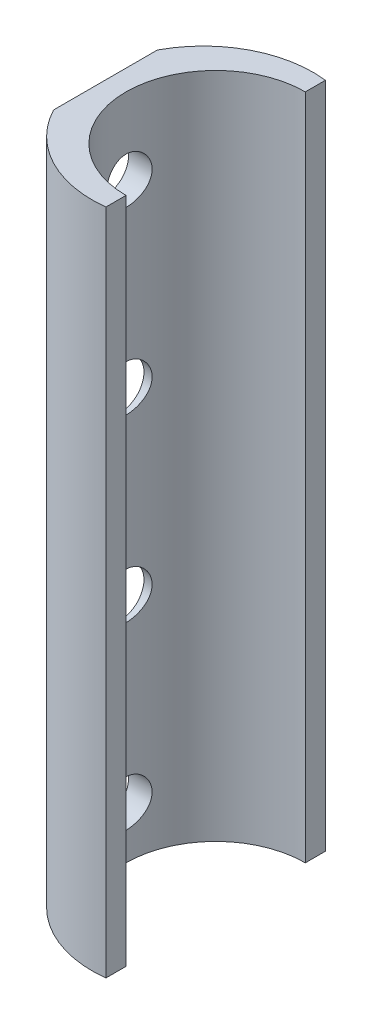
ISO-10303-21;
HEADER;
FILE_DESCRIPTION(('STEP AP214'),'2;1');
FILE_NAME('part.step','',(''),(''),'','','');
FILE_SCHEMA(('AUTOMOTIVE_DESIGN { 1 0 10303 214 1 1 1 1 }'));
ENDSEC;
DATA;
#1=APPLICATION_CONTEXT('core data for automotive mechanical design processes');
#2=APPLICATION_PROTOCOL_DEFINITION('international standard','automotive_design',2000,#1);
#3=PRODUCT_CONTEXT('',#1,'mechanical');
#4=PRODUCT('Part','Part','',(#3));
#5=PRODUCT_RELATED_PRODUCT_CATEGORY('part','',(#4));
#6=PRODUCT_DEFINITION_FORMATION('','',#4);
#7=PRODUCT_DEFINITION_CONTEXT('part definition',#1,'design');
#8=PRODUCT_DEFINITION('design','',#6,#7);
#9=PRODUCT_DEFINITION_SHAPE('','',#8);
#10=(LENGTH_UNIT() NAMED_UNIT(*) SI_UNIT(.MILLI.,.METRE.));
#11=(NAMED_UNIT(*) PLANE_ANGLE_UNIT() SI_UNIT($,.RADIAN.));
#12=(NAMED_UNIT(*) SI_UNIT($,.STERADIAN.) SOLID_ANGLE_UNIT());
#13=UNCERTAINTY_MEASURE_WITH_UNIT(LENGTH_MEASURE(1.E-05),#10,'distance_accuracy_value','');
#14=(GEOMETRIC_REPRESENTATION_CONTEXT(3) GLOBAL_UNCERTAINTY_ASSIGNED_CONTEXT((#13)) GLOBAL_UNIT_ASSIGNED_CONTEXT((#10,
#11,#12)) REPRESENTATION_CONTEXT('',''));
#15=CARTESIAN_POINT('',(0.,0.,0.));
#16=DIRECTION('',(0.,0.,1.));
#17=DIRECTION('',(1.,0.,0.));
#18=AXIS2_PLACEMENT_3D('',#15,#16,#17);
#19=CARTESIAN_POINT('',(-76.5804417880104,84.1602094264812,20.2));
#20=DIRECTION('',(0.,-1.,0.));
#21=DIRECTION('',(0.,0.,-1.));
#22=AXIS2_PLACEMENT_3D('',#19,#20,#21);
#23=PLANE('',#22);
#24=DIRECTION('',(0.,0.,1.));
#25=VECTOR('',#24,1.);
#26=CARTESIAN_POINT('',(-55.1204417880104,84.1602094264812,0.));
#27=LINE('',#26,#25);
#28=CARTESIAN_POINT('',(-55.1204417880104,84.1602094264812,27.56));
#29=VERTEX_POINT('',#28);
#30=CARTESIAN_POINT('',(-55.1204417880104,84.1602094264812,31.47));
#31=VERTEX_POINT('',#30);
#32=EDGE_CURVE('E172',#29,#31,#27,.T.);
#33=ORIENTED_EDGE('',*,*,#32,.F.);
#34=CARTESIAN_POINT('',(-55.1204417880104,84.1602094264812,10.1));
#35=DIRECTION('',(0.,1.,0.));
#36=DIRECTION('',(0.,0.,1.));
#37=AXIS2_PLACEMENT_3D('',#34,#35,#36);
#38=CIRCLE('',#37,17.46);
#39=CARTESIAN_POINT('',(-55.1204417880104,84.1602094264812,-7.36000000000001));
#40=VERTEX_POINT('',#39);
#41=EDGE_CURVE('E191',#40,#29,#38,.T.);
#42=ORIENTED_EDGE('',*,*,#41,.F.);
#43=DIRECTION('',(0.,0.,1.));
#44=VECTOR('',#43,1.);
#45=CARTESIAN_POINT('',(-55.1204417880104,84.1602094264812,0.));
#46=LINE('',#45,#44);
#47=CARTESIAN_POINT('',(-55.1204417880104,84.1602094264812,-11.27));
#48=VERTEX_POINT('',#47);
#49=EDGE_CURVE('E185',#48,#40,#46,.T.);
#50=ORIENTED_EDGE('',*,*,#49,.F.);
#51=CARTESIAN_POINT('',(-57.6669665242023,84.1602094264812,9.94773107021489));
#52=DIRECTION('',(0.,1.,0.));
#53=DIRECTION('',(0.,0.,1.));
#54=AXIS2_PLACEMENT_3D('',#51,#52,#53);
#55=CIRCLE('',#54,21.37);
#56=CARTESIAN_POINT('',(-76.5804417880104,84.1602094264812,0.));
#57=VERTEX_POINT('',#56);
#58=EDGE_CURVE('E78',#57,#48,#55,.F.);
#59=ORIENTED_EDGE('',*,*,#58,.F.);
#60=DIRECTION('',(0.,0.,-1.));
#61=VECTOR('',#60,1.);
#62=CARTESIAN_POINT('',(-76.5804417880104,84.1602094264812,20.2));
#63=LINE('',#62,#61);
#64=CARTESIAN_POINT('',(-76.5804417880104,84.1602094264812,20.2));
#65=VERTEX_POINT('',#64);
#66=EDGE_CURVE('E214',#65,#57,#63,.T.);
#67=ORIENTED_EDGE('',*,*,#66,.F.);
#68=CARTESIAN_POINT('',(-57.6669665242023,84.1602094264812,10.2522689297851));
#69=DIRECTION('',(0.,1.,0.));
#70=DIRECTION('',(0.,0.,1.));
#71=AXIS2_PLACEMENT_3D('',#68,#69,#70);
#72=CIRCLE('',#71,21.37);
#73=EDGE_CURVE('E175',#65,#31,#72,.T.);
#74=ORIENTED_EDGE('',*,*,#73,.T.);
#75=EDGE_LOOP('',(#33,#42,#50,#59,#67,#74));
#76=FACE_BOUND('',#75,.T.);
#77=ADVANCED_FACE('F43',(#76),#23,.F.);
#78=CARTESIAN_POINT('',(-76.5804417880104,84.1602094264812,20.2));
#79=DIRECTION('',(1.,0.,0.));
#80=DIRECTION('',(0.,1.,0.));
#81=AXIS2_PLACEMENT_3D('',#78,#79,#80);
#82=PLANE('',#81);
#83=CARTESIAN_POINT('',(-76.5804417880104,69.1602094264812,10.1));
#84=DIRECTION('',(-1.,0.,0.));
#85=DIRECTION('',(0.,-1.,0.));
#86=AXIS2_PLACEMENT_3D('',#83,#84,#85);
#87=CIRCLE('',#86,4.5);
#88=CARTESIAN_POINT('',(-76.5804417880104,64.6602094264812,10.1));
#89=VERTEX_POINT('',#88);
#90=EDGE_CURVE('E150',#89,#89,#87,.T.);
#91=ORIENTED_EDGE('',*,*,#90,.F.);
#92=EDGE_LOOP('',(#91));
#93=FACE_BOUND('',#92,.T.);
#94=DIRECTION('',(0.,-1.,0.));
#95=VECTOR('',#94,1.);
#96=CARTESIAN_POINT('',(-76.5804417880104,84.1602094264812,0.));
#97=LINE('',#96,#95);
#98=CARTESIAN_POINT('',(-76.5804417880104,48.2602094264812,0.));
#99=VERTEX_POINT('',#98);
#100=EDGE_CURVE('E197',#57,#99,#97,.T.);
#101=ORIENTED_EDGE('',*,*,#100,.T.);
#102=DIRECTION('',(0.,0.,-1.));
#103=VECTOR('',#102,1.);
#104=CARTESIAN_POINT('',(-76.5804417880104,48.2602094264812,20.2));
#105=LINE('',#104,#103);
#106=CARTESIAN_POINT('',(-76.5804417880104,48.2602094264812,20.2));
#107=VERTEX_POINT('',#106);
#108=EDGE_CURVE('E135',#107,#99,#105,.T.);
#109=ORIENTED_EDGE('',*,*,#108,.F.);
#110=DIRECTION('',(0.,-1.,0.));
#111=VECTOR('',#110,1.);
#112=CARTESIAN_POINT('',(-76.5804417880104,84.1602094264812,20.2));
#113=LINE('',#112,#111);
#114=EDGE_CURVE('E200',#65,#107,#113,.T.);
#115=ORIENTED_EDGE('',*,*,#114,.F.);
#116=ORIENTED_EDGE('',*,*,#66,.T.);
#117=EDGE_LOOP('',(#101,#109,#115,#116));
#118=FACE_BOUND('',#117,.T.);
#119=ADVANCED_FACE('F258',(#93,#118),#82,.F.);
#120=CARTESIAN_POINT('',(-76.5804417880104,48.2602094264812,20.2));
#121=DIRECTION('',(0.,1.,0.));
#122=DIRECTION('',(0.,0.,1.));
#123=AXIS2_PLACEMENT_3D('',#120,#121,#122);
#124=PLANE('',#123);
#125=ORIENTED_EDGE('',*,*,#108,.T.);
#126=CARTESIAN_POINT('',(-57.6669665242023,48.2602094264812,9.94773107021489));
#127=DIRECTION('',(0.,1.,0.));
#128=DIRECTION('',(0.,0.,1.));
#129=AXIS2_PLACEMENT_3D('',#126,#127,#128);
#130=CIRCLE('',#129,21.37);
#131=CARTESIAN_POINT('',(-73.5804417880104,48.2602094264812,-4.3154454703797));
#132=VERTEX_POINT('',#131);
#133=EDGE_CURVE('E84',#132,#99,#130,.T.);
#134=ORIENTED_EDGE('',*,*,#133,.F.);
#135=DIRECTION('',(0.,0.,-1.));
#136=VECTOR('',#135,1.);
#137=CARTESIAN_POINT('',(-73.5804417880104,48.2602094264812,20.2));
#138=LINE('',#137,#136);
#139=CARTESIAN_POINT('',(-73.5804417880104,48.2602094264812,24.5154454703797));
#140=VERTEX_POINT('',#139);
#141=EDGE_CURVE('E57',#140,#132,#138,.T.);
#142=ORIENTED_EDGE('',*,*,#141,.F.);
#143=CARTESIAN_POINT('',(-57.6669665242023,48.2602094264812,10.2522689297851));
#144=DIRECTION('',(0.,1.,0.));
#145=DIRECTION('',(0.,0.,1.));
#146=AXIS2_PLACEMENT_3D('',#143,#144,#145);
#147=CIRCLE('',#146,21.37);
#148=EDGE_CURVE('E50',#140,#107,#147,.F.);
#149=ORIENTED_EDGE('',*,*,#148,.T.);
#150=EDGE_LOOP('',(#125,#134,#142,#149));
#151=FACE_BOUND('',#150,.T.);
#152=ADVANCED_FACE('F139',(#151),#124,.F.);
#153=CARTESIAN_POINT('',(-73.5804417880104,48.2602094264812,20.2));
#154=DIRECTION('',(1.,0.,0.));
#155=DIRECTION('',(0.,1.,0.));
#156=AXIS2_PLACEMENT_3D('',#153,#154,#155);
#157=PLANE('',#156);
#158=CARTESIAN_POINT('',(-73.5804417880104,34.1602094264812,10.1));
#159=DIRECTION('',(1.,0.,0.));
#160=DIRECTION('',(0.,1.,0.));
#161=AXIS2_PLACEMENT_3D('',#158,#159,#160);
#162=CIRCLE('',#161,4.5);
#163=CARTESIAN_POINT('',(-73.5804417880104,38.6602094264812,10.1));
#164=VERTEX_POINT('',#163);
#165=EDGE_CURVE('E161',#164,#164,#162,.T.);
#166=ORIENTED_EDGE('',*,*,#165,.T.);
#167=EDGE_LOOP('',(#166));
#168=FACE_BOUND('',#167,.T.);
#169=CARTESIAN_POINT('',(-73.5804417880104,-0.839790573518796,10.1));
#170=DIRECTION('',(1.,0.,0.));
#171=DIRECTION('',(0.,1.,0.));
#172=AXIS2_PLACEMENT_3D('',#169,#170,#171);
#173=CIRCLE('',#172,4.5);
#174=CARTESIAN_POINT('',(-73.5804417880104,3.6602094264812,10.1));
#175=VERTEX_POINT('',#174);
#176=EDGE_CURVE('E156',#175,#175,#173,.T.);
#177=ORIENTED_EDGE('',*,*,#176,.T.);
#178=EDGE_LOOP('',(#177));
#179=FACE_BOUND('',#178,.T.);
#180=ORIENTED_EDGE('',*,*,#141,.T.);
#181=DIRECTION('',(0.,1.,0.));
#182=VECTOR('',#181,1.);
#183=CARTESIAN_POINT('',(-73.5804417880104,-45.8397905735188,-4.3154454703797));
#184=LINE('',#183,#182);
#185=CARTESIAN_POINT('',(-73.5804417880104,-9.93979057351879,-4.3154454703797));
#186=VERTEX_POINT('',#185);
#187=EDGE_CURVE('E130',#186,#132,#184,.T.);
#188=ORIENTED_EDGE('',*,*,#187,.F.);
#189=DIRECTION('',(0.,0.,-1.));
#190=VECTOR('',#189,1.);
#191=CARTESIAN_POINT('',(-73.5804417880104,-9.93979057351879,20.2));
#192=LINE('',#191,#190);
#193=CARTESIAN_POINT('',(-73.5804417880104,-9.93979057351879,24.5154454703797));
#194=VERTEX_POINT('',#193);
#195=EDGE_CURVE('E136',#194,#186,#192,.T.);
#196=ORIENTED_EDGE('',*,*,#195,.F.);
#197=DIRECTION('',(0.,1.,0.));
#198=VECTOR('',#197,1.);
#199=CARTESIAN_POINT('',(-73.5804417880104,-45.8397905735188,24.5154454703797));
#200=LINE('',#199,#198);
#201=EDGE_CURVE('E133',#194,#140,#200,.T.);
#202=ORIENTED_EDGE('',*,*,#201,.T.);
#203=EDGE_LOOP('',(#180,#188,#196,#202));
#204=FACE_BOUND('',#203,.T.);
#205=ADVANCED_FACE('F129',(#168,#179,#204),#157,.F.);
#206=CARTESIAN_POINT('',(-73.5804417880104,-9.93979057351879,20.2));
#207=DIRECTION('',(0.,-1.,0.));
#208=DIRECTION('',(0.,0.,-1.));
#209=AXIS2_PLACEMENT_3D('',#206,#207,#208);
#210=PLANE('',#209);
#211=ORIENTED_EDGE('',*,*,#195,.T.);
#212=CARTESIAN_POINT('',(-57.6669665242023,-9.93979057351879,9.94773107021489));
#213=DIRECTION('',(0.,-1.,0.));
#214=DIRECTION('',(0.,0.,-1.));
#215=AXIS2_PLACEMENT_3D('',#212,#213,#214);
#216=CIRCLE('',#215,21.37);
#217=CARTESIAN_POINT('',(-76.5804417880104,-9.93979057351879,0.));
#218=VERTEX_POINT('',#217);
#219=EDGE_CURVE('E141',#218,#186,#216,.T.);
#220=ORIENTED_EDGE('',*,*,#219,.F.);
#221=DIRECTION('',(0.,0.,-1.));
#222=VECTOR('',#221,1.);
#223=CARTESIAN_POINT('',(-76.5804417880104,-9.93979057351879,20.2));
#224=LINE('',#223,#222);
#225=CARTESIAN_POINT('',(-76.5804417880104,-9.93979057351879,20.2));
#226=VERTEX_POINT('',#225);
#227=EDGE_CURVE('E209',#226,#218,#224,.T.);
#228=ORIENTED_EDGE('',*,*,#227,.F.);
#229=CARTESIAN_POINT('',(-57.6669665242023,-9.93979057351879,10.2522689297851));
#230=DIRECTION('',(0.,-1.,0.));
#231=DIRECTION('',(0.,0.,-1.));
#232=AXIS2_PLACEMENT_3D('',#229,#230,#231);
#233=CIRCLE('',#232,21.37);
#234=EDGE_CURVE('E11',#226,#194,#233,.F.);
#235=ORIENTED_EDGE('',*,*,#234,.T.);
#236=EDGE_LOOP('',(#211,#220,#228,#235));
#237=FACE_BOUND('',#236,.T.);
#238=ADVANCED_FACE('F279',(#237),#210,.F.);
#239=CARTESIAN_POINT('',(-76.5804417880104,-9.93979057351879,20.2));
#240=DIRECTION('',(1.,0.,0.));
#241=DIRECTION('',(0.,1.,0.));
#242=AXIS2_PLACEMENT_3D('',#239,#240,#241);
#243=PLANE('',#242);
#244=CARTESIAN_POINT('',(-76.5804417880104,-35.8397905735188,10.1));
#245=DIRECTION('',(-1.,0.,0.));
#246=DIRECTION('',(0.,-1.,0.));
#247=AXIS2_PLACEMENT_3D('',#244,#245,#246);
#248=CIRCLE('',#247,4.5);
#249=CARTESIAN_POINT('',(-76.5804417880104,-40.3397905735188,10.1));
#250=VERTEX_POINT('',#249);
#251=EDGE_CURVE('E149',#250,#250,#248,.T.);
#252=ORIENTED_EDGE('',*,*,#251,.F.);
#253=EDGE_LOOP('',(#252));
#254=FACE_BOUND('',#253,.T.);
#255=DIRECTION('',(0.,-1.,0.));
#256=VECTOR('',#255,1.);
#257=CARTESIAN_POINT('',(-76.5804417880104,-9.93979057351879,0.));
#258=LINE('',#257,#256);
#259=CARTESIAN_POINT('',(-76.5804417880104,-45.8397905735188,0.));
#260=VERTEX_POINT('',#259);
#261=EDGE_CURVE('E204',#218,#260,#258,.T.);
#262=ORIENTED_EDGE('',*,*,#261,.T.);
#263=DIRECTION('',(0.,0.,-1.));
#264=VECTOR('',#263,1.);
#265=CARTESIAN_POINT('',(-76.5804417880104,-45.8397905735188,20.2));
#266=LINE('',#265,#264);
#267=CARTESIAN_POINT('',(-76.5804417880104,-45.8397905735188,20.2));
#268=VERTEX_POINT('',#267);
#269=EDGE_CURVE('E66',#268,#260,#266,.T.);
#270=ORIENTED_EDGE('',*,*,#269,.F.);
#271=DIRECTION('',(0.,-1.,0.));
#272=VECTOR('',#271,1.);
#273=CARTESIAN_POINT('',(-76.5804417880104,-9.93979057351879,20.2));
#274=LINE('',#273,#272);
#275=EDGE_CURVE('E203',#226,#268,#274,.T.);
#276=ORIENTED_EDGE('',*,*,#275,.F.);
#277=ORIENTED_EDGE('',*,*,#227,.T.);
#278=EDGE_LOOP('',(#262,#270,#276,#277));
#279=FACE_BOUND('',#278,.T.);
#280=ADVANCED_FACE('F276',(#254,#279),#243,.F.);
#281=CARTESIAN_POINT('',(-72.5804417880104,-45.8397905735188,20.2));
#282=DIRECTION('',(0.,1.,0.));
#283=DIRECTION('',(0.,0.,1.));
#284=AXIS2_PLACEMENT_3D('',#281,#282,#283);
#285=PLANE('',#284);
#286=CARTESIAN_POINT('',(-55.1204417880104,-45.8397905735188,10.1));
#287=DIRECTION('',(0.,1.,0.));
#288=DIRECTION('',(0.,0.,1.));
#289=AXIS2_PLACEMENT_3D('',#286,#287,#288);
#290=CIRCLE('',#289,17.46);
#291=CARTESIAN_POINT('',(-55.1204417880104,-45.8397905735188,-7.36000000000001));
#292=VERTEX_POINT('',#291);
#293=CARTESIAN_POINT('',(-55.1204417880104,-45.8397905735188,27.56));
#294=VERTEX_POINT('',#293);
#295=EDGE_CURVE('E184',#292,#294,#290,.T.);
#296=ORIENTED_EDGE('',*,*,#295,.T.);
#297=DIRECTION('',(0.,0.,1.));
#298=VECTOR('',#297,1.);
#299=CARTESIAN_POINT('',(-55.1204417880104,-45.8397905735188,0.));
#300=LINE('',#299,#298);
#301=CARTESIAN_POINT('',(-55.1204417880104,-45.8397905735188,31.47));
#302=VERTEX_POINT('',#301);
#303=EDGE_CURVE('E167',#294,#302,#300,.T.);
#304=ORIENTED_EDGE('',*,*,#303,.T.);
#305=CARTESIAN_POINT('',(-57.6669665242023,-45.8397905735188,10.2522689297851));
#306=DIRECTION('',(0.,1.,0.));
#307=DIRECTION('',(0.,0.,1.));
#308=AXIS2_PLACEMENT_3D('',#305,#306,#307);
#309=CIRCLE('',#308,21.37);
#310=EDGE_CURVE('E168',#268,#302,#309,.T.);
#311=ORIENTED_EDGE('',*,*,#310,.F.);
#312=ORIENTED_EDGE('',*,*,#269,.T.);
#313=CARTESIAN_POINT('',(-57.6669665242023,-45.8397905735188,9.94773107021489));
#314=DIRECTION('',(0.,1.,0.));
#315=DIRECTION('',(0.,0.,1.));
#316=AXIS2_PLACEMENT_3D('',#313,#314,#315);
#317=CIRCLE('',#316,21.37);
#318=CARTESIAN_POINT('',(-55.1204417880104,-45.8397905735188,-11.27));
#319=VERTEX_POINT('',#318);
#320=EDGE_CURVE('E181',#260,#319,#317,.F.);
#321=ORIENTED_EDGE('',*,*,#320,.T.);
#322=DIRECTION('',(0.,0.,1.));
#323=VECTOR('',#322,1.);
#324=CARTESIAN_POINT('',(-55.1204417880104,-45.8397905735188,0.));
#325=LINE('',#324,#323);
#326=EDGE_CURVE('E187',#319,#292,#325,.T.);
#327=ORIENTED_EDGE('',*,*,#326,.T.);
#328=EDGE_LOOP('',(#296,#304,#311,#312,#321,#327));
#329=FACE_BOUND('',#328,.T.);
#330=ADVANCED_FACE('F256',(#329),#285,.F.);
#331=CARTESIAN_POINT('',(-57.6669665242023,-45.8397905735188,9.94773107021489));
#332=DIRECTION('',(0.,1.,0.));
#333=DIRECTION('',(0.,0.,1.));
#334=AXIS2_PLACEMENT_3D('',#331,#332,#333);
#335=CYLINDRICAL_SURFACE('',#334,21.37);
#336=ORIENTED_EDGE('',*,*,#261,.F.);
#337=ORIENTED_EDGE('',*,*,#219,.T.);
#338=ORIENTED_EDGE('',*,*,#187,.T.);
#339=ORIENTED_EDGE('',*,*,#133,.T.);
#340=ORIENTED_EDGE('',*,*,#100,.F.);
#341=ORIENTED_EDGE('',*,*,#58,.T.);
#342=DIRECTION('',(0.,1.,0.));
#343=VECTOR('',#342,1.);
#344=CARTESIAN_POINT('',(-55.1204417880104,-45.8397905735188,-11.27));
#345=LINE('',#344,#343);
#346=EDGE_CURVE('E194',#319,#48,#345,.T.);
#347=ORIENTED_EDGE('',*,*,#346,.F.);
#348=ORIENTED_EDGE('',*,*,#320,.F.);
#349=EDGE_LOOP('',(#336,#337,#338,#339,#340,#341,#347,#348));
#350=FACE_BOUND('',#349,.T.);
#351=ADVANCED_FACE('F144',(#350),#335,.T.);
#352=CARTESIAN_POINT('',(-55.1204417880104,-45.8397905735188,0.));
#353=DIRECTION('',(-1.,0.,0.));
#354=DIRECTION('',(0.,0.,1.));
#355=AXIS2_PLACEMENT_3D('',#352,#353,#354);
#356=PLANE('',#355);
#357=ORIENTED_EDGE('',*,*,#49,.T.);
#358=DIRECTION('',(0.,1.,0.));
#359=VECTOR('',#358,1.);
#360=CARTESIAN_POINT('',(-55.1204417880104,-45.8397905735188,-7.36000000000001));
#361=LINE('',#360,#359);
#362=EDGE_CURVE('E189',#292,#40,#361,.T.);
#363=ORIENTED_EDGE('',*,*,#362,.F.);
#364=ORIENTED_EDGE('',*,*,#326,.F.);
#365=ORIENTED_EDGE('',*,*,#346,.T.);
#366=EDGE_LOOP('',(#357,#363,#364,#365));
#367=FACE_BOUND('',#366,.T.);
#368=ADVANCED_FACE('F248',(#367),#356,.F.);
#369=CARTESIAN_POINT('',(-55.1204417880104,-45.8397905735188,10.1));
#370=DIRECTION('',(0.,1.,0.));
#371=DIRECTION('',(0.,0.,1.));
#372=AXIS2_PLACEMENT_3D('',#369,#370,#371);
#373=CYLINDRICAL_SURFACE('',#372,17.46);
#374=CARTESIAN_POINT('',(-72.5804417880104,64.6602094264812,10.1));
#375=CARTESIAN_POINT('',(-72.5804377749056,64.6602159243551,10.348374589537));
#376=CARTESIAN_POINT('',(-72.575089456618,64.6808418121384,10.5968203690008));
#377=CARTESIAN_POINT('',(-72.5542727198641,64.7626665987296,11.0865747450076));
#378=CARTESIAN_POINT('',(-72.5387989616777,64.8238869055094,11.3278795054662));
#379=CARTESIAN_POINT('',(-72.4994422782698,64.9847929662988,11.7962100294906));
#380=CARTESIAN_POINT('',(-72.4755697960074,65.0844309665096,12.0232531147015));
#381=CARTESIAN_POINT('',(-72.4219491519052,65.3191719044398,12.457403927084));
#382=CARTESIAN_POINT('',(-72.3922007025692,65.4542765775607,12.6645106780833));
#383=CARTESIAN_POINT('',(-72.3293250580716,65.7592236885891,13.0574211672073));
#384=CARTESIAN_POINT('',(-72.2961431395174,65.9296941289406,13.2427287590731));
#385=CARTESIAN_POINT('',(-72.2304983182207,66.2991901475405,13.5824660687046));
#386=CARTESIAN_POINT('',(-72.1980355021438,66.4982191462524,13.7368920824678));
#387=CARTESIAN_POINT('',(-72.1369490997662,66.9230841681838,14.0128550877485));
#388=CARTESIAN_POINT('',(-72.1083947926668,67.1492962264596,14.1338298820554));
#389=CARTESIAN_POINT('',(-72.0591595051791,67.6197023195589,14.3358384192313));
#390=CARTESIAN_POINT('',(-72.0384771787701,67.8638932716629,14.4168789911047));
#391=CARTESIAN_POINT('',(-72.0078911926671,68.3578517481709,14.5350121118167));
#392=CARTESIAN_POINT('',(-71.9977682608514,68.6073912037582,14.5730001807476));
#393=CARTESIAN_POINT('',(-71.9887914354361,69.1094907153349,14.6067405269387));
#394=CARTESIAN_POINT('',(-71.9899355852395,69.3620502392631,14.6025001374254));
#395=CARTESIAN_POINT('',(-72.0031669286432,69.8560999907504,14.5526168109999));
#396=CARTESIAN_POINT('',(-72.0149700851396,70.0977075219875,14.508048457291));
#397=CARTESIAN_POINT('',(-72.0477358920302,70.569894838154,14.3804916724267));
#398=CARTESIAN_POINT('',(-72.0686992313379,70.8004737922053,14.2975003515522));
#399=CARTESIAN_POINT('',(-72.1176790531389,71.2469033348393,14.0945561045106));
#400=CARTESIAN_POINT('',(-72.1457682151619,71.4625710880562,13.9742192631909));
#401=CARTESIAN_POINT('',(-72.2057946112841,71.8710342699764,13.7002680820404));
#402=CARTESIAN_POINT('',(-72.2377325569255,72.0638254562691,13.5466475847068));
#403=CARTESIAN_POINT('',(-72.3030476516647,72.4272125649169,13.2049563437764));
#404=CARTESIAN_POINT('',(-72.3364390468451,72.5969562616217,13.0159807863677));
#405=CARTESIAN_POINT('',(-72.4000259521178,72.902511114719,12.6118421933381));
#406=CARTESIAN_POINT('',(-72.4302213521131,73.0383211023686,12.396678256118));
#407=CARTESIAN_POINT('',(-72.4841800815041,73.2724945615196,11.9450073447436));
#408=CARTESIAN_POINT('',(-72.5079182959877,73.3707124061176,11.7084216731863));
#409=CARTESIAN_POINT('',(-72.5461059244779,73.5257405824996,11.2213472761736));
#410=CARTESIAN_POINT('',(-72.5605572303106,73.5825593479607,10.9708613936165));
#411=CARTESIAN_POINT('',(-72.5782600037622,73.6518582928354,10.47037722528));
#412=CARTESIAN_POINT('',(-72.5818043325257,73.6654981561251,10.2205496330901));
#413=CARTESIAN_POINT('',(-72.5781315163446,73.6512428138637,9.72217936395482));
#414=CARTESIAN_POINT('',(-72.570915405263,73.6233515986182,9.47363656586881));
#415=CARTESIAN_POINT('',(-72.5467208887778,73.5277796763209,8.98897081386272));
#416=CARTESIAN_POINT('',(-72.529899387674,73.4607381014528,8.75271328207287));
#417=CARTESIAN_POINT('',(-72.4883952725939,73.2895041012146,8.29481494223848));
#418=CARTESIAN_POINT('',(-72.4637118370201,73.1853077929189,8.07317566477204));
#419=CARTESIAN_POINT('',(-72.4085272725294,72.9405187581192,7.6462405124079));
#420=CARTESIAN_POINT('',(-72.3779264588549,72.7992850054806,7.44132537912078));
#421=CARTESIAN_POINT('',(-72.3144479549432,72.4852433325432,7.05769408346084));
#422=CARTESIAN_POINT('',(-72.2815698464869,72.312429603068,6.87898275222963));
#423=CARTESIAN_POINT('',(-72.2161773618771,71.9347358585201,6.54800343844683));
#424=CARTESIAN_POINT('',(-72.183695099558,71.7291341654302,6.39655120705365));
#425=CARTESIAN_POINT('',(-72.1237269860062,71.294756383578,6.13029077257513));
#426=CARTESIAN_POINT('',(-72.0962409174838,71.0659813033247,6.01548097570785));
#427=CARTESIAN_POINT('',(-72.0496870669837,70.592946090341,5.82662675158796));
#428=CARTESIAN_POINT('',(-72.0305698285298,70.3487869601738,5.75234217568132));
#429=CARTESIAN_POINT('',(-72.0028860720606,69.8508722589985,5.64604117387188));
#430=CARTESIAN_POINT('',(-71.9943170717008,69.597118960305,5.61401480310752));
#431=CARTESIAN_POINT('',(-71.9888975754563,69.0955427834005,5.59368321248024));
#432=CARTESIAN_POINT('',(-71.9916967362581,68.8477758508441,5.60407093157169));
#433=CARTESIAN_POINT('',(-72.007883480311,68.3576547206893,5.6652627364942));
#434=CARTESIAN_POINT('',(-72.0212708242841,68.1153004009006,5.7160659089924));
#435=CARTESIAN_POINT('',(-72.0569241095299,67.6444073405907,5.85591223814078));
#436=CARTESIAN_POINT('',(-72.0791296842328,67.4157865896949,5.9446957074859));
#437=CARTESIAN_POINT('',(-72.129922583712,66.9765176711471,6.15777900650128));
#438=CARTESIAN_POINT('',(-72.1585108475568,66.7658721544541,6.28208406312362));
#439=CARTESIAN_POINT('',(-72.2198344189099,66.3622520863242,6.56671727122538));
#440=CARTESIAN_POINT('',(-72.2526624588011,66.1699263009781,6.72794555274661));
#441=CARTESIAN_POINT('',(-72.3182297523906,65.8146348417116,7.08011365584957));
#442=CARTESIAN_POINT('',(-72.3509689829036,65.651676221292,7.27106059488538));
#443=CARTESIAN_POINT('',(-72.4134356800829,65.3566213245203,7.68175865247575));
#444=CARTESIAN_POINT('',(-72.44309161189,65.2251919207615,7.90200061725223));
#445=CARTESIAN_POINT('',(-72.4952834030081,65.0014322730685,8.36220364065297));
#446=CARTESIAN_POINT('',(-72.5178241204573,64.9090753364454,8.6021511030495));
#447=CARTESIAN_POINT('',(-72.5501028234594,64.7790368418701,9.05122079237697));
#448=CARTESIAN_POINT('',(-72.5613996353782,64.7345761093012,9.25829385385468));
#449=CARTESIAN_POINT('',(-72.5765705099571,64.67516089404,9.67689431180898));
#450=CARTESIAN_POINT('',(-72.5804452065863,64.6602038912469,9.88842132628512));
#451=CARTESIAN_POINT('',(-72.5804417880104,64.6602094264812,10.1));
#452=B_SPLINE_CURVE_WITH_KNOTS('',3,(#374,#375,#376,#377,#378,#379,#380,#381,#382,#383,#384,
#385,#386,#387,#388,#389,#390,#391,#392,#393,#394,#395,#396,#397,#398,#399,#400,#401,#402,#403,
#404,#405,#406,#407,#408,#409,#410,#411,#412,#413,#414,#415,#416,#417,#418,#419,#420,#421,#422,
#423,#424,#425,#426,#427,#428,#429,#430,#431,#432,#433,#434,#435,#436,#437,#438,#439,#440,#441,
#442,#443,#444,#445,#446,#447,#448,#449,#450,#451),.UNSPECIFIED.,.T.,.F.,(4,2,2,2,2,2,2,2,2,2,2,
2,2,2,2,2,2,2,2,2,2,2,2,2,2,2,2,2,2,2,2,2,2,2,2,2,2,2,4),(0.,0.744348158882409,1.48908917155635,
2.23290742834129,2.97676208729914,3.7351721491186,4.49367312177896,5.2642387007996,
6.03467246247058,6.78876837136924,7.54273332924743,8.27718123282827,9.01168438183138,
9.7540034600459,10.4964599853196,11.2614722957349,12.0265109510282,12.7944839693657,
13.5623004951247,14.3093122363752,15.0562522093763,15.7913263389494,16.5264773113593,
17.2753043640153,18.0242693032605,18.7928625790217,19.5614224198569,20.3253769584671,
21.0891516792658,21.8295698531468,22.5699712950857,23.3053892420549,24.0409154605236,
24.7967569147685,25.5527796682052,26.3236076492084,27.0939081788103,27.7280376617451,
28.3621129773079),.UNSPECIFIED.);
#453=CARTESIAN_POINT('',(-72.5804417880104,64.6602094264812,10.1));
#454=VERTEX_POINT('',#453);
#455=EDGE_CURVE('E164',#454,#454,#452,.T.);
#456=ORIENTED_EDGE('',*,*,#455,.T.);
#457=EDGE_LOOP('',(#456));
#458=FACE_BOUND('',#457,.T.);
#459=CARTESIAN_POINT('',(-72.5804417880104,29.6602094264812,10.1));
#460=CARTESIAN_POINT('',(-72.5804377749056,29.6602159243551,10.348374589537));
#461=CARTESIAN_POINT('',(-72.575089456618,29.6808418121384,10.5968203690008));
#462=CARTESIAN_POINT('',(-72.554272719864,29.7626665987295,11.0865747450076));
#463=CARTESIAN_POINT('',(-72.5387989616777,29.8238869055094,11.3278795054662));
#464=CARTESIAN_POINT('',(-72.4994422782698,29.9847929662988,11.7962100294906));
#465=CARTESIAN_POINT('',(-72.4755697960074,30.0844309665097,12.0232531147015));
#466=CARTESIAN_POINT('',(-72.4219491519052,30.3191719044398,12.457403927084));
#467=CARTESIAN_POINT('',(-72.3922007025692,30.4542765775607,12.6645106780833));
#468=CARTESIAN_POINT('',(-72.3293250580716,30.7592236885891,13.0574211672074));
#469=CARTESIAN_POINT('',(-72.2961431395174,30.9296941289406,13.2427287590731));
#470=CARTESIAN_POINT('',(-72.2304983182207,31.2991901475405,13.5824660687046));
#471=CARTESIAN_POINT('',(-72.1980355021438,31.4982191462524,13.7368920824678));
#472=CARTESIAN_POINT('',(-72.1369490997662,31.9230841681838,14.0128550877486));
#473=CARTESIAN_POINT('',(-72.1083947926668,32.1492962264596,14.1338298820554));
#474=CARTESIAN_POINT('',(-72.0591595051791,32.6197023195589,14.3358384192313));
#475=CARTESIAN_POINT('',(-72.0384771787701,32.863893271663,14.4168789911047));
#476=CARTESIAN_POINT('',(-72.0078911926671,33.3578517481709,14.5350121118167));
#477=CARTESIAN_POINT('',(-71.9977682608514,33.6073912037582,14.5730001807476));
#478=CARTESIAN_POINT('',(-71.9887914354361,34.1094907153349,14.6067405269387));
#479=CARTESIAN_POINT('',(-71.9899355852395,34.3620502392631,14.6025001374254));
#480=CARTESIAN_POINT('',(-72.0031669286432,34.8560999907504,14.5526168109999));
#481=CARTESIAN_POINT('',(-72.0149700851396,35.0977075219875,14.508048457291));
#482=CARTESIAN_POINT('',(-72.0477358920302,35.5698948381539,14.3804916724267));
#483=CARTESIAN_POINT('',(-72.0686992313378,35.8004737922053,14.2975003515522));
#484=CARTESIAN_POINT('',(-72.1176790531388,36.2469033348393,14.0945561045106));
#485=CARTESIAN_POINT('',(-72.1457682151619,36.4625710880562,13.974219263191));
#486=CARTESIAN_POINT('',(-72.2057946112841,36.8710342699764,13.7002680820405));
#487=CARTESIAN_POINT('',(-72.2377325569255,37.0638254562692,13.5466475847068));
#488=CARTESIAN_POINT('',(-72.3030476516646,37.4272125649169,13.2049563437764));
#489=CARTESIAN_POINT('',(-72.3364390468451,37.5969562616217,13.0159807863677));
#490=CARTESIAN_POINT('',(-72.4000259521178,37.902511114719,12.6118421933381));
#491=CARTESIAN_POINT('',(-72.4302213521131,38.0383211023686,12.396678256118));
#492=CARTESIAN_POINT('',(-72.4841800815041,38.2724945615196,11.9450073447436));
#493=CARTESIAN_POINT('',(-72.5079182959877,38.3707124061176,11.7084216731863));
#494=CARTESIAN_POINT('',(-72.5461059244779,38.5257405824996,11.2213472761736));
#495=CARTESIAN_POINT('',(-72.5605572303106,38.5825593479607,10.9708613936165));
#496=CARTESIAN_POINT('',(-72.5782600037622,38.6518582928354,10.47037722528));
#497=CARTESIAN_POINT('',(-72.5818043325257,38.6654981561251,10.2205496330901));
#498=CARTESIAN_POINT('',(-72.5781315163446,38.6512428138637,9.72217936395484));
#499=CARTESIAN_POINT('',(-72.570915405263,38.6233515986182,9.47363656586882));
#500=CARTESIAN_POINT('',(-72.5467208887778,38.5277796763209,8.98897081386273));
#501=CARTESIAN_POINT('',(-72.529899387674,38.4607381014528,8.75271328207288));
#502=CARTESIAN_POINT('',(-72.4883952725939,38.2895041012146,8.29481494223849));
#503=CARTESIAN_POINT('',(-72.4637118370201,38.1853077929189,8.07317566477205));
#504=CARTESIAN_POINT('',(-72.4085272725294,37.9405187581192,7.64624051240791));
#505=CARTESIAN_POINT('',(-72.3779264588549,37.7992850054807,7.44132537912079));
#506=CARTESIAN_POINT('',(-72.3144479549432,37.4852433325432,7.05769408346085));
#507=CARTESIAN_POINT('',(-72.2815698464869,37.312429603068,6.87898275222964));
#508=CARTESIAN_POINT('',(-72.2161773618771,36.9347358585201,6.54800343844684));
#509=CARTESIAN_POINT('',(-72.183695099558,36.7291341654302,6.39655120705366));
#510=CARTESIAN_POINT('',(-72.1237269860062,36.294756383578,6.13029077257515));
#511=CARTESIAN_POINT('',(-72.0962409174838,36.0659813033248,6.01548097570785));
#512=CARTESIAN_POINT('',(-72.0496870669837,35.592946090341,5.82662675158797));
#513=CARTESIAN_POINT('',(-72.0305698285298,35.3487869601738,5.75234217568133));
#514=CARTESIAN_POINT('',(-72.0028860720606,34.8508722589985,5.64604117387189));
#515=CARTESIAN_POINT('',(-71.9943170717008,34.597118960305,5.61401480310753));
#516=CARTESIAN_POINT('',(-71.9888975754563,34.0955427834005,5.59368321248024));
#517=CARTESIAN_POINT('',(-71.9916967362581,33.8477758508441,5.60407093157169));
#518=CARTESIAN_POINT('',(-72.007883480311,33.3576547206893,5.6652627364942));
#519=CARTESIAN_POINT('',(-72.0212708242841,33.1153004009006,5.71606590899241));
#520=CARTESIAN_POINT('',(-72.0569241095299,32.6444073405907,5.85591223814079));
#521=CARTESIAN_POINT('',(-72.0791296842328,32.4157865896949,5.9446957074859));
#522=CARTESIAN_POINT('',(-72.129922583712,31.9765176711471,6.15777900650128));
#523=CARTESIAN_POINT('',(-72.1585108475568,31.7658721544541,6.28208406312362));
#524=CARTESIAN_POINT('',(-72.2198344189099,31.3622520863242,6.56671727122538));
#525=CARTESIAN_POINT('',(-72.2526624588011,31.1699263009781,6.72794555274662));
#526=CARTESIAN_POINT('',(-72.3182297523906,30.8146348417116,7.08011365584958));
#527=CARTESIAN_POINT('',(-72.3509689829036,30.651676221292,7.27106059488539));
#528=CARTESIAN_POINT('',(-72.4134356800829,30.3566213245203,7.68175865247575));
#529=CARTESIAN_POINT('',(-72.44309161189,30.2251919207615,7.90200061725223));
#530=CARTESIAN_POINT('',(-72.4952834030081,30.0014322730685,8.36220364065297));
#531=CARTESIAN_POINT('',(-72.5178241204573,29.9090753364454,8.60215110304951));
#532=CARTESIAN_POINT('',(-72.5501028234594,29.7790368418701,9.05122079237698));
#533=CARTESIAN_POINT('',(-72.5613996353782,29.7345761093012,9.25829385385469));
#534=CARTESIAN_POINT('',(-72.5765705099571,29.67516089404,9.67689431180899));
#535=CARTESIAN_POINT('',(-72.5804452065863,29.6602038912469,9.88842132628513));
#536=CARTESIAN_POINT('',(-72.5804417880104,29.6602094264812,10.1));
#537=B_SPLINE_CURVE_WITH_KNOTS('',3,(#459,#460,#461,#462,#463,#464,#465,#466,#467,#468,#469,
#470,#471,#472,#473,#474,#475,#476,#477,#478,#479,#480,#481,#482,#483,#484,#485,#486,#487,#488,
#489,#490,#491,#492,#493,#494,#495,#496,#497,#498,#499,#500,#501,#502,#503,#504,#505,#506,#507,
#508,#509,#510,#511,#512,#513,#514,#515,#516,#517,#518,#519,#520,#521,#522,#523,#524,#525,#526,
#527,#528,#529,#530,#531,#532,#533,#534,#535,#536),.UNSPECIFIED.,.T.,.F.,(4,2,2,2,2,2,2,2,2,2,2,
2,2,2,2,2,2,2,2,2,2,2,2,2,2,2,2,2,2,2,2,2,2,2,2,2,2,2,4),(0.,0.744348158882407,1.48908917155635,
2.23290742834128,2.97676208729913,3.7351721491186,4.49367312177896,5.26423870079959,
6.03467246247059,6.78876837136925,7.54273332924744,8.27718123282827,9.01168438183136,
9.75400346004588,10.4964599853196,11.2614722957349,12.0265109510282,12.7944839693657,
13.5623004951247,14.3093122363752,15.0562522093763,15.7913263389494,16.5264773113594,
17.2753043640153,18.0242693032605,18.7928625790217,19.5614224198569,20.3253769584671,
21.0891516792658,21.8295698531468,22.5699712950857,23.3053892420549,24.0409154605237,
24.7967569147685,25.5527796682052,26.3236076492084,27.0939081788103,27.7280376617452,
28.3621129773079),.UNSPECIFIED.);
#538=CARTESIAN_POINT('',(-72.5804417880104,29.6602094264812,10.1));
#539=VERTEX_POINT('',#538);
#540=EDGE_CURVE('E159',#539,#539,#537,.T.);
#541=ORIENTED_EDGE('',*,*,#540,.T.);
#542=EDGE_LOOP('',(#541));
#543=FACE_BOUND('',#542,.T.);
#544=CARTESIAN_POINT('',(-72.5804417880104,-5.3397905735188,10.1));
#545=CARTESIAN_POINT('',(-72.5804377749056,-5.3397840756449,10.348374589537));
#546=CARTESIAN_POINT('',(-72.575089456618,-5.31915818786156,10.5968203690008));
#547=CARTESIAN_POINT('',(-72.5542727198641,-5.23733340127046,11.0865747450076));
#548=CARTESIAN_POINT('',(-72.5387989616777,-5.1761130944906,11.3278795054662));
#549=CARTESIAN_POINT('',(-72.4994422782698,-5.01520703370117,11.7962100294906));
#550=CARTESIAN_POINT('',(-72.4755697960074,-4.91556903349035,12.0232531147015));
#551=CARTESIAN_POINT('',(-72.4219491519052,-4.68082809556017,12.457403927084));
#552=CARTESIAN_POINT('',(-72.3922007025692,-4.54572342243934,12.6645106780833));
#553=CARTESIAN_POINT('',(-72.3293250580716,-4.24077631141088,13.0574211672074));
#554=CARTESIAN_POINT('',(-72.2961431395174,-4.07030587105942,13.2427287590731));
#555=CARTESIAN_POINT('',(-72.2304983182207,-3.7008098524595,13.5824660687046));
#556=CARTESIAN_POINT('',(-72.1980355021438,-3.5017808537476,13.7368920824678));
#557=CARTESIAN_POINT('',(-72.1369490997662,-3.0769158318162,14.0128550877486));
#558=CARTESIAN_POINT('',(-72.1083947926668,-2.85070377354038,14.1338298820554));
#559=CARTESIAN_POINT('',(-72.059159505179,-2.38029768044111,14.3358384192313));
#560=CARTESIAN_POINT('',(-72.0384771787701,-2.13610672833705,14.4168789911047));
#561=CARTESIAN_POINT('',(-72.0078911926671,-1.64214825182912,14.5350121118167));
#562=CARTESIAN_POINT('',(-71.9977682608514,-1.3926087962418,14.5730001807476));
#563=CARTESIAN_POINT('',(-71.9887914354361,-0.890509284665068,14.6067405269387));
#564=CARTESIAN_POINT('',(-71.9899355852395,-0.637949760736942,14.6025001374254));
#565=CARTESIAN_POINT('',(-72.0031669286432,-0.143900009249651,14.5526168109999));
#566=CARTESIAN_POINT('',(-72.0149700851396,0.0977075219875323,14.508048457291));
#567=CARTESIAN_POINT('',(-72.0477358920302,0.569894838153938,14.3804916724267));
#568=CARTESIAN_POINT('',(-72.0686992313378,0.800473792205275,14.2975003515522));
#569=CARTESIAN_POINT('',(-72.1176790531388,1.24690333483931,14.0945561045106));
#570=CARTESIAN_POINT('',(-72.1457682151619,1.46257108805614,13.974219263191));
#571=CARTESIAN_POINT('',(-72.2057946112841,1.87103426997639,13.7002680820405));
#572=CARTESIAN_POINT('',(-72.2377325569255,2.06382545626913,13.5466475847068));
#573=CARTESIAN_POINT('',(-72.3030476516646,2.4272125649169,13.2049563437764));
#574=CARTESIAN_POINT('',(-72.3364390468451,2.59695626162168,13.0159807863677));
#575=CARTESIAN_POINT('',(-72.4000259521178,2.90251111471895,12.6118421933381));
#576=CARTESIAN_POINT('',(-72.4302213521131,3.03832110236863,12.396678256118));
#577=CARTESIAN_POINT('',(-72.4841800815041,3.27249456151962,11.9450073447436));
#578=CARTESIAN_POINT('',(-72.5079182959877,3.37071240611755,11.7084216731863));
#579=CARTESIAN_POINT('',(-72.5461059244779,3.52574058249959,11.2213472761736));
#580=CARTESIAN_POINT('',(-72.5605572303106,3.5825593479607,10.9708613936165));
#581=CARTESIAN_POINT('',(-72.5782600037622,3.65185829283544,10.47037722528));
#582=CARTESIAN_POINT('',(-72.5818043325257,3.66549815612514,10.2205496330901));
#583=CARTESIAN_POINT('',(-72.5781315163446,3.65124281386372,9.72217936395483));
#584=CARTESIAN_POINT('',(-72.570915405263,3.6233515986182,9.47363656586882));
#585=CARTESIAN_POINT('',(-72.5467208887778,3.5277796763209,8.98897081386273));
#586=CARTESIAN_POINT('',(-72.529899387674,3.46073810145275,8.75271328207288));
#587=CARTESIAN_POINT('',(-72.4883952725939,3.28950410121457,8.29481494223849));
#588=CARTESIAN_POINT('',(-72.4637118370201,3.18530779291886,8.07317566477205));
#589=CARTESIAN_POINT('',(-72.4085272725294,2.94051875811922,7.64624051240791));
#590=CARTESIAN_POINT('',(-72.3779264588549,2.79928500548064,7.44132537912079));
#591=CARTESIAN_POINT('',(-72.3144479549432,2.4852433325432,7.05769408346085));
#592=CARTESIAN_POINT('',(-72.2815698464869,2.31242960306803,6.87898275222964));
#593=CARTESIAN_POINT('',(-72.2161773618771,1.93473585852013,6.54800343844684));
#594=CARTESIAN_POINT('',(-72.183695099558,1.72913416543019,6.39655120705366));
#595=CARTESIAN_POINT('',(-72.1237269860062,1.294756383578,6.13029077257515));
#596=CARTESIAN_POINT('',(-72.0962409174838,1.06598130332475,6.01548097570785));
#597=CARTESIAN_POINT('',(-72.0496870669837,0.592946090341002,5.82662675158797));
#598=CARTESIAN_POINT('',(-72.0305698285298,0.348786960173796,5.75234217568133));
#599=CARTESIAN_POINT('',(-72.0028860720606,-0.149127741001497,5.64604117387189));
#600=CARTESIAN_POINT('',(-71.9943170717008,-0.40288103969499,5.61401480310753));
#601=CARTESIAN_POINT('',(-71.9888975754563,-0.904457216599535,5.59368321248024));
#602=CARTESIAN_POINT('',(-71.9916967362581,-1.15222414915587,5.60407093157169));
#603=CARTESIAN_POINT('',(-72.007883480311,-1.64234527931067,5.6652627364942));
#604=CARTESIAN_POINT('',(-72.0212708242841,-1.88469959909939,5.71606590899241));
#605=CARTESIAN_POINT('',(-72.0569241095299,-2.35559265940933,5.85591223814079));
#606=CARTESIAN_POINT('',(-72.0791296842328,-2.58421341030514,5.9446957074859));
#607=CARTESIAN_POINT('',(-72.129922583712,-3.02348232885291,6.15777900650129));
#608=CARTESIAN_POINT('',(-72.1585108475568,-3.23412784554591,6.28208406312362));
#609=CARTESIAN_POINT('',(-72.2198344189099,-3.63774791367577,6.56671727122538));
#610=CARTESIAN_POINT('',(-72.2526624588011,-3.83007369902193,6.72794555274662));
#611=CARTESIAN_POINT('',(-72.3182297523906,-4.18536515828837,7.08011365584958));
#612=CARTESIAN_POINT('',(-72.3509689829036,-4.34832377870801,7.27106059488539));
#613=CARTESIAN_POINT('',(-72.4134356800829,-4.64337867547972,7.68175865247575));
#614=CARTESIAN_POINT('',(-72.44309161189,-4.77480807923854,7.90200061725223));
#615=CARTESIAN_POINT('',(-72.4952834030081,-4.99856772693152,8.36220364065297));
#616=CARTESIAN_POINT('',(-72.5178241204573,-5.0909246635546,8.60215110304951));
#617=CARTESIAN_POINT('',(-72.5501028234594,-5.22096315812988,9.05122079237697));
#618=CARTESIAN_POINT('',(-72.5613996353782,-5.26542389069884,9.25829385385469));
#619=CARTESIAN_POINT('',(-72.5765705099571,-5.32483910595997,9.67689431180899));
#620=CARTESIAN_POINT('',(-72.5804452065863,-5.33979610875307,9.88842132628513));
#621=CARTESIAN_POINT('',(-72.5804417880104,-5.3397905735188,10.1));
#622=B_SPLINE_CURVE_WITH_KNOTS('',3,(#544,#545,#546,#547,#548,#549,#550,#551,#552,#553,#554,
#555,#556,#557,#558,#559,#560,#561,#562,#563,#564,#565,#566,#567,#568,#569,#570,#571,#572,#573,
#574,#575,#576,#577,#578,#579,#580,#581,#582,#583,#584,#585,#586,#587,#588,#589,#590,#591,#592,
#593,#594,#595,#596,#597,#598,#599,#600,#601,#602,#603,#604,#605,#606,#607,#608,#609,#610,#611,
#612,#613,#614,#615,#616,#617,#618,#619,#620,#621),.UNSPECIFIED.,.T.,.F.,(4,2,2,2,2,2,2,2,2,2,2,
2,2,2,2,2,2,2,2,2,2,2,2,2,2,2,2,2,2,2,2,2,2,2,2,2,2,2,4),(0.,0.744348158882407,1.48908917155635,
2.23290742834129,2.97676208729913,3.7351721491186,4.49367312177896,5.2642387007996,
6.03467246247058,6.78876837136924,7.54273332924743,8.27718123282826,9.01168438183136,
9.75400346004588,10.4964599853196,11.2614722957349,12.0265109510282,12.7944839693657,
13.5623004951247,14.3093122363752,15.0562522093763,15.7913263389494,16.5264773113593,
17.2753043640153,18.0242693032605,18.7928625790217,19.5614224198569,20.3253769584671,
21.0891516792658,21.8295698531468,22.5699712950857,23.3053892420549,24.0409154605236,
24.7967569147685,25.5527796682052,26.3236076492083,27.0939081788103,27.7280376617451,
28.3621129773079),.UNSPECIFIED.);
#623=CARTESIAN_POINT('',(-72.5804417880104,-5.3397905735188,10.1));
#624=VERTEX_POINT('',#623);
#625=EDGE_CURVE('E160',#624,#624,#622,.T.);
#626=ORIENTED_EDGE('',*,*,#625,.T.);
#627=EDGE_LOOP('',(#626));
#628=FACE_BOUND('',#627,.T.);
#629=CARTESIAN_POINT('',(-72.5804417880104,-40.3397905735188,10.1));
#630=CARTESIAN_POINT('',(-72.5804377749056,-40.3397840756449,10.348374589537));
#631=CARTESIAN_POINT('',(-72.575089456618,-40.3191581878616,10.5968203690008));
#632=CARTESIAN_POINT('',(-72.554272719864,-40.2373334012705,11.0865747450076));
#633=CARTESIAN_POINT('',(-72.5387989616777,-40.1761130944906,11.3278795054662));
#634=CARTESIAN_POINT('',(-72.4994422782698,-40.0152070337012,11.7962100294906));
#635=CARTESIAN_POINT('',(-72.4755697960074,-39.9155690334904,12.0232531147015));
#636=CARTESIAN_POINT('',(-72.4219491519052,-39.6808280955602,12.4574039270841));
#637=CARTESIAN_POINT('',(-72.3922007025692,-39.5457234224393,12.6645106780833));
#638=CARTESIAN_POINT('',(-72.3293250580716,-39.2407763114109,13.0574211672074));
#639=CARTESIAN_POINT('',(-72.2961431395174,-39.0703058710594,13.2427287590731));
#640=CARTESIAN_POINT('',(-72.2304983182207,-38.7008098524595,13.5824660687046));
#641=CARTESIAN_POINT('',(-72.1980355021438,-38.5017808537476,13.7368920824678));
#642=CARTESIAN_POINT('',(-72.1369490997662,-38.0769158318162,14.0128550877486));
#643=CARTESIAN_POINT('',(-72.1083947926668,-37.8507037735404,14.1338298820554));
#644=CARTESIAN_POINT('',(-72.0591595051791,-37.3802976804411,14.3358384192313));
#645=CARTESIAN_POINT('',(-72.0384771787701,-37.136106728337,14.4168789911047));
#646=CARTESIAN_POINT('',(-72.0078911926671,-36.6421482518291,14.5350121118167));
#647=CARTESIAN_POINT('',(-71.9977682608514,-36.3926087962418,14.5730001807476));
#648=CARTESIAN_POINT('',(-71.9887914354361,-35.8905092846651,14.6067405269387));
#649=CARTESIAN_POINT('',(-71.9899355852395,-35.6379497607369,14.6025001374254));
#650=CARTESIAN_POINT('',(-72.0031669286432,-35.1439000092496,14.5526168109999));
#651=CARTESIAN_POINT('',(-72.0149700851396,-34.9022924780125,14.508048457291));
#652=CARTESIAN_POINT('',(-72.0477358920302,-34.4301051618461,14.3804916724267));
#653=CARTESIAN_POINT('',(-72.0686992313378,-34.1995262077947,14.2975003515522));
#654=CARTESIAN_POINT('',(-72.1176790531389,-33.7530966651607,14.0945561045106));
#655=CARTESIAN_POINT('',(-72.1457682151619,-33.5374289119439,13.974219263191));
#656=CARTESIAN_POINT('',(-72.2057946112841,-33.1289657300236,13.7002680820405));
#657=CARTESIAN_POINT('',(-72.2377325569255,-32.9361745437309,13.5466475847068));
#658=CARTESIAN_POINT('',(-72.3030476516646,-32.5727874350831,13.2049563437764));
#659=CARTESIAN_POINT('',(-72.3364390468451,-32.4030437383783,13.0159807863677));
#660=CARTESIAN_POINT('',(-72.4000259521178,-32.0974888852811,12.6118421933381));
#661=CARTESIAN_POINT('',(-72.4302213521131,-31.9616788976314,12.396678256118));
#662=CARTESIAN_POINT('',(-72.4841800815041,-31.7275054384804,11.9450073447436));
#663=CARTESIAN_POINT('',(-72.5079182959877,-31.6292875938824,11.7084216731863));
#664=CARTESIAN_POINT('',(-72.5461059244779,-31.4742594175004,11.2213472761736));
#665=CARTESIAN_POINT('',(-72.5605572303106,-31.4174406520393,10.9708613936165));
#666=CARTESIAN_POINT('',(-72.5782600037622,-31.3481417071646,10.47037722528));
#667=CARTESIAN_POINT('',(-72.5818043325257,-31.3345018438749,10.2205496330901));
#668=CARTESIAN_POINT('',(-72.5781315163446,-31.3487571861363,9.72217936395484));
#669=CARTESIAN_POINT('',(-72.570915405263,-31.3766484013818,9.47363656586882));
#670=CARTESIAN_POINT('',(-72.5467208887778,-31.4722203236791,8.98897081386274));
#671=CARTESIAN_POINT('',(-72.529899387674,-31.5392618985472,8.75271328207288));
#672=CARTESIAN_POINT('',(-72.4883952725939,-31.7104958987854,8.29481494223849));
#673=CARTESIAN_POINT('',(-72.4637118370201,-31.8146922070811,8.07317566477206));
#674=CARTESIAN_POINT('',(-72.4085272725294,-32.0594812418808,7.64624051240791));
#675=CARTESIAN_POINT('',(-72.3779264588549,-32.2007149945194,7.4413253791208));
#676=CARTESIAN_POINT('',(-72.3144479549432,-32.5147566674568,7.05769408346085));
#677=CARTESIAN_POINT('',(-72.2815698464869,-32.687570396932,6.87898275222964));
#678=CARTESIAN_POINT('',(-72.2161773618771,-33.0652641414799,6.54800343844685));
#679=CARTESIAN_POINT('',(-72.183695099558,-33.2708658345698,6.39655120705367));
#680=CARTESIAN_POINT('',(-72.1237269860062,-33.705243616422,6.13029077257515));
#681=CARTESIAN_POINT('',(-72.0962409174838,-33.9340186966752,6.01548097570786));
#682=CARTESIAN_POINT('',(-72.0496870669837,-34.407053909659,5.82662675158797));
#683=CARTESIAN_POINT('',(-72.0305698285298,-34.6512130398262,5.75234217568133));
#684=CARTESIAN_POINT('',(-72.0028860720606,-35.1491277410015,5.6460411738719));
#685=CARTESIAN_POINT('',(-71.9943170717008,-35.402881039695,5.61401480310754));
#686=CARTESIAN_POINT('',(-71.9888975754563,-35.9044572165995,5.59368321248025));
#687=CARTESIAN_POINT('',(-71.9916967362581,-36.1522241491559,5.6040709315717));
#688=CARTESIAN_POINT('',(-72.007883480311,-36.6423452793107,5.66526273649421));
#689=CARTESIAN_POINT('',(-72.0212708242841,-36.8846995990994,5.71606590899242));
#690=CARTESIAN_POINT('',(-72.0569241095299,-37.3555926594093,5.8559122381408));
#691=CARTESIAN_POINT('',(-72.0791296842328,-37.5842134103051,5.94469570748591));
#692=CARTESIAN_POINT('',(-72.129922583712,-38.0234823288529,6.15777900650129));
#693=CARTESIAN_POINT('',(-72.1585108475568,-38.2341278455459,6.28208406312363));
#694=CARTESIAN_POINT('',(-72.2198344189099,-38.6377479136758,6.56671727122539));
#695=CARTESIAN_POINT('',(-72.2526624588011,-38.8300736990219,6.72794555274663));
#696=CARTESIAN_POINT('',(-72.3182297523906,-39.1853651582884,7.08011365584959));
#697=CARTESIAN_POINT('',(-72.3509689829036,-39.348323778708,7.2710605948854));
#698=CARTESIAN_POINT('',(-72.4134356800829,-39.6433786754797,7.68175865247576));
#699=CARTESIAN_POINT('',(-72.44309161189,-39.7748080792385,7.90200061725225));
#700=CARTESIAN_POINT('',(-72.4952834030081,-39.9985677269315,8.36220364065299));
#701=CARTESIAN_POINT('',(-72.5178241204573,-40.0909246635546,8.60215110304952));
#702=CARTESIAN_POINT('',(-72.5501028234594,-40.2209631581299,9.05122079237698));
#703=CARTESIAN_POINT('',(-72.5613996353782,-40.2654238906988,9.2582938538547));
#704=CARTESIAN_POINT('',(-72.5765705099571,-40.32483910596,9.676894311809));
#705=CARTESIAN_POINT('',(-72.5804452065863,-40.3397961087531,9.88842132628513));
#706=CARTESIAN_POINT('',(-72.5804417880104,-40.3397905735188,10.1));
#707=B_SPLINE_CURVE_WITH_KNOTS('',3,(#629,#630,#631,#632,#633,#634,#635,#636,#637,#638,#639,
#640,#641,#642,#643,#644,#645,#646,#647,#648,#649,#650,#651,#652,#653,#654,#655,#656,#657,#658,
#659,#660,#661,#662,#663,#664,#665,#666,#667,#668,#669,#670,#671,#672,#673,#674,#675,#676,#677,
#678,#679,#680,#681,#682,#683,#684,#685,#686,#687,#688,#689,#690,#691,#692,#693,#694,#695,#696,
#697,#698,#699,#700,#701,#702,#703,#704,#705,#706),.UNSPECIFIED.,.T.,.F.,(4,2,2,2,2,2,2,2,2,2,2,
2,2,2,2,2,2,2,2,2,2,2,2,2,2,2,2,2,2,2,2,2,2,2,2,2,2,2,4),(0.,0.744348158882406,1.48908917155635,
2.23290742834128,2.97676208729913,3.7351721491186,4.49367312177895,5.2642387007996,
6.03467246247058,6.78876837136924,7.54273332924744,8.27718123282827,9.01168438183136,
9.75400346004588,10.4964599853196,11.2614722957349,12.0265109510282,12.7944839693657,
13.5623004951247,14.3093122363752,15.0562522093763,15.7913263389494,16.5264773113593,
17.2753043640153,18.0242693032605,18.7928625790217,19.5614224198569,20.3253769584671,
21.0891516792658,21.8295698531468,22.5699712950857,23.3053892420549,24.0409154605236,
24.7967569147685,25.5527796682052,26.3236076492084,27.0939081788103,27.7280376617451,
28.3621129773079),.UNSPECIFIED.);
#708=CARTESIAN_POINT('',(-72.5804417880104,-40.3397905735188,10.1));
#709=VERTEX_POINT('',#708);
#710=EDGE_CURVE('E153',#709,#709,#707,.T.);
#711=ORIENTED_EDGE('',*,*,#710,.T.);
#712=EDGE_LOOP('',(#711));
#713=FACE_BOUND('',#712,.T.);
#714=ORIENTED_EDGE('',*,*,#41,.T.);
#715=DIRECTION('',(0.,1.,0.));
#716=VECTOR('',#715,1.);
#717=CARTESIAN_POINT('',(-55.1204417880104,-45.8397905735188,27.56));
#718=LINE('',#717,#716);
#719=EDGE_CURVE('E169',#294,#29,#718,.T.);
#720=ORIENTED_EDGE('',*,*,#719,.F.);
#721=ORIENTED_EDGE('',*,*,#295,.F.);
#722=ORIENTED_EDGE('',*,*,#362,.T.);
#723=EDGE_LOOP('',(#714,#720,#721,#722));
#724=FACE_BOUND('',#723,.T.);
#725=ADVANCED_FACE('F229',(#458,#543,#628,#713,#724),#373,.F.);
#726=CARTESIAN_POINT('',(-55.1204417880104,-45.8397905735188,0.));
#727=DIRECTION('',(-1.,0.,0.));
#728=DIRECTION('',(0.,0.,1.));
#729=AXIS2_PLACEMENT_3D('',#726,#727,#728);
#730=PLANE('',#729);
#731=ORIENTED_EDGE('',*,*,#32,.T.);
#732=DIRECTION('',(0.,1.,0.));
#733=VECTOR('',#732,1.);
#734=CARTESIAN_POINT('',(-55.1204417880104,-45.8397905735188,31.47));
#735=LINE('',#734,#733);
#736=EDGE_CURVE('E165',#302,#31,#735,.T.);
#737=ORIENTED_EDGE('',*,*,#736,.F.);
#738=ORIENTED_EDGE('',*,*,#303,.F.);
#739=ORIENTED_EDGE('',*,*,#719,.T.);
#740=EDGE_LOOP('',(#731,#737,#738,#739));
#741=FACE_BOUND('',#740,.T.);
#742=ADVANCED_FACE('F244',(#741),#730,.F.);
#743=CARTESIAN_POINT('',(-57.6669665242023,-45.8397905735188,10.2522689297851));
#744=DIRECTION('',(0.,1.,0.));
#745=DIRECTION('',(0.,0.,1.));
#746=AXIS2_PLACEMENT_3D('',#743,#744,#745);
#747=CYLINDRICAL_SURFACE('',#746,21.37);
#748=ORIENTED_EDGE('',*,*,#234,.F.);
#749=ORIENTED_EDGE('',*,*,#275,.T.);
#750=ORIENTED_EDGE('',*,*,#310,.T.);
#751=ORIENTED_EDGE('',*,*,#736,.T.);
#752=ORIENTED_EDGE('',*,*,#73,.F.);
#753=ORIENTED_EDGE('',*,*,#114,.T.);
#754=ORIENTED_EDGE('',*,*,#148,.F.);
#755=ORIENTED_EDGE('',*,*,#201,.F.);
#756=EDGE_LOOP('',(#748,#749,#750,#751,#752,#753,#754,#755));
#757=FACE_BOUND('',#756,.T.);
#758=ADVANCED_FACE('F238',(#757),#747,.T.);
#759=CARTESIAN_POINT('',(-66.5804417880104,-35.8397905735188,10.1));
#760=DIRECTION('',(-1.,0.,0.));
#761=DIRECTION('',(0.,-1.,0.));
#762=AXIS2_PLACEMENT_3D('',#759,#760,#761);
#763=CYLINDRICAL_SURFACE('',#762,4.5);
#764=ORIENTED_EDGE('',*,*,#251,.T.);
#765=EDGE_LOOP('',(#764));
#766=FACE_BOUND('',#765,.T.);
#767=ORIENTED_EDGE('',*,*,#710,.F.);
#768=EDGE_LOOP('',(#767));
#769=FACE_BOUND('',#768,.T.);
#770=ADVANCED_FACE('F233',(#766,#769),#763,.F.);
#771=CARTESIAN_POINT('',(-66.5804417880104,-0.839790573518793,10.1));
#772=DIRECTION('',(-1.,0.,0.));
#773=DIRECTION('',(0.,-1.,0.));
#774=AXIS2_PLACEMENT_3D('',#771,#772,#773);
#775=CYLINDRICAL_SURFACE('',#774,4.5);
#776=ORIENTED_EDGE('',*,*,#625,.F.);
#777=EDGE_LOOP('',(#776));
#778=FACE_BOUND('',#777,.T.);
#779=ORIENTED_EDGE('',*,*,#176,.F.);
#780=EDGE_LOOP('',(#779));
#781=FACE_BOUND('',#780,.T.);
#782=ADVANCED_FACE('F237',(#778,#781),#775,.F.);
#783=CARTESIAN_POINT('',(-66.5804417880104,34.1602094264812,10.1));
#784=DIRECTION('',(-1.,0.,0.));
#785=DIRECTION('',(0.,-1.,0.));
#786=AXIS2_PLACEMENT_3D('',#783,#784,#785);
#787=CYLINDRICAL_SURFACE('',#786,4.5);
#788=ORIENTED_EDGE('',*,*,#540,.F.);
#789=EDGE_LOOP('',(#788));
#790=FACE_BOUND('',#789,.T.);
#791=ORIENTED_EDGE('',*,*,#165,.F.);
#792=EDGE_LOOP('',(#791));
#793=FACE_BOUND('',#792,.T.);
#794=ADVANCED_FACE('F292',(#790,#793),#787,.F.);
#795=CARTESIAN_POINT('',(-66.5804417880104,69.1602094264812,10.1));
#796=DIRECTION('',(-1.,0.,0.));
#797=DIRECTION('',(0.,-1.,0.));
#798=AXIS2_PLACEMENT_3D('',#795,#796,#797);
#799=CYLINDRICAL_SURFACE('',#798,4.5);
#800=ORIENTED_EDGE('',*,*,#90,.T.);
#801=EDGE_LOOP('',(#800));
#802=FACE_BOUND('',#801,.T.);
#803=ORIENTED_EDGE('',*,*,#455,.F.);
#804=EDGE_LOOP('',(#803));
#805=FACE_BOUND('',#804,.T.);
#806=ADVANCED_FACE('F289',(#802,#805),#799,.F.);
#807=CLOSED_SHELL('',(#77,#119,#152,#205,#238,#280,#330,#351,#368,#725,#742,#758,#770,#782,#794,#806));
#808=MANIFOLD_SOLID_BREP('B2',#807);
#809=ADVANCED_BREP_SHAPE_REPRESENTATION('',(#18,#808),#14);
#810=SHAPE_DEFINITION_REPRESENTATION(#9,#809);
ENDSEC;
END-ISO-10303-21;
